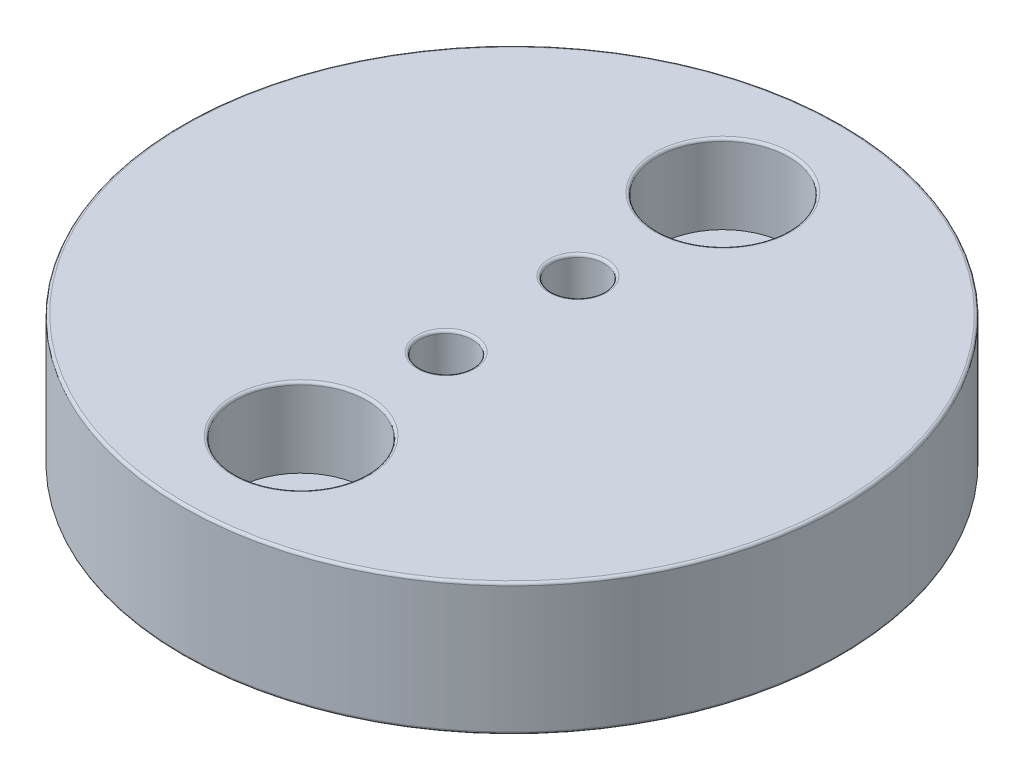
ISO-10303-21;
HEADER;
FILE_DESCRIPTION(('STEP AP214'),'2;1');
FILE_NAME('part.step','',(''),(''),'','','');
FILE_SCHEMA(('AUTOMOTIVE_DESIGN { 1 0 10303 214 1 1 1 1 }'));
ENDSEC;
DATA;
#1=APPLICATION_CONTEXT('core data for automotive mechanical design processes');
#2=APPLICATION_PROTOCOL_DEFINITION('international standard','automotive_design',2000,#1);
#3=PRODUCT_CONTEXT('',#1,'mechanical');
#4=PRODUCT('Part','Part','',(#3));
#5=PRODUCT_RELATED_PRODUCT_CATEGORY('part','',(#4));
#6=PRODUCT_DEFINITION_FORMATION('','',#4);
#7=PRODUCT_DEFINITION_CONTEXT('part definition',#1,'design');
#8=PRODUCT_DEFINITION('design','',#6,#7);
#9=PRODUCT_DEFINITION_SHAPE('','',#8);
#10=(LENGTH_UNIT() NAMED_UNIT(*) SI_UNIT(.MILLI.,.METRE.));
#11=(NAMED_UNIT(*) PLANE_ANGLE_UNIT() SI_UNIT($,.RADIAN.));
#12=(NAMED_UNIT(*) SI_UNIT($,.STERADIAN.) SOLID_ANGLE_UNIT());
#13=UNCERTAINTY_MEASURE_WITH_UNIT(LENGTH_MEASURE(1.E-05),#10,'distance_accuracy_value','');
#14=(GEOMETRIC_REPRESENTATION_CONTEXT(3) GLOBAL_UNCERTAINTY_ASSIGNED_CONTEXT((#13)) GLOBAL_UNIT_ASSIGNED_CONTEXT((#10,
#11,#12)) REPRESENTATION_CONTEXT('',''));
#15=CARTESIAN_POINT('',(0.,0.,0.));
#16=DIRECTION('',(0.,0.,1.));
#17=DIRECTION('',(1.,0.,0.));
#18=AXIS2_PLACEMENT_3D('',#15,#16,#17);
#19=CARTESIAN_POINT('',(0.,-0.00100000000000013,2.5));
#20=DIRECTION('',(0.,1.,0.));
#21=DIRECTION('',(0.,0.,1.));
#22=AXIS2_PLACEMENT_3D('',#19,#20,#21);
#23=CYLINDRICAL_SURFACE('',#22,1.);
#24=CARTESIAN_POINT('',(0.,3.3,2.5));
#25=DIRECTION('',(0.,-1.,0.));
#26=DIRECTION('',(0.,0.,-1.));
#27=AXIS2_PLACEMENT_3D('',#24,#25,#26);
#28=CIRCLE('',#27,1.);
#29=CARTESIAN_POINT('',(0.,3.3,1.5));
#30=VERTEX_POINT('',#29);
#31=EDGE_CURVE('E109',#30,#30,#28,.T.);
#32=ORIENTED_EDGE('',*,*,#31,.T.);
#33=EDGE_LOOP('',(#32));
#34=FACE_BOUND('',#33,.T.);
#35=CARTESIAN_POINT('',(0.,4.9,2.5));
#36=DIRECTION('',(0.,1.,0.));
#37=DIRECTION('',(0.,0.,1.));
#38=AXIS2_PLACEMENT_3D('',#35,#36,#37);
#39=CIRCLE('',#38,1.);
#40=CARTESIAN_POINT('',(0.,4.9,3.5));
#41=VERTEX_POINT('',#40);
#42=EDGE_CURVE('E112',#41,#41,#39,.T.);
#43=ORIENTED_EDGE('',*,*,#42,.T.);
#44=EDGE_LOOP('',(#43));
#45=FACE_BOUND('',#44,.T.);
#46=ADVANCED_FACE('F35',(#34,#45),#23,.F.);
#47=CARTESIAN_POINT('',(0.,-0.00100000000000013,-2.5));
#48=DIRECTION('',(0.,1.,0.));
#49=DIRECTION('',(0.,0.,1.));
#50=AXIS2_PLACEMENT_3D('',#47,#48,#49);
#51=CYLINDRICAL_SURFACE('',#50,1.);
#52=CARTESIAN_POINT('',(0.,3.3,-2.5));
#53=DIRECTION('',(0.,-1.,0.));
#54=DIRECTION('',(0.,0.,-1.));
#55=AXIS2_PLACEMENT_3D('',#52,#53,#54);
#56=CIRCLE('',#55,1.);
#57=CARTESIAN_POINT('',(0.,3.3,-3.5));
#58=VERTEX_POINT('',#57);
#59=EDGE_CURVE('E118',#58,#58,#56,.T.);
#60=ORIENTED_EDGE('',*,*,#59,.T.);
#61=EDGE_LOOP('',(#60));
#62=FACE_BOUND('',#61,.T.);
#63=CARTESIAN_POINT('',(0.,4.9,-2.5));
#64=DIRECTION('',(0.,1.,0.));
#65=DIRECTION('',(0.,0.,1.));
#66=AXIS2_PLACEMENT_3D('',#63,#64,#65);
#67=CIRCLE('',#66,1.);
#68=CARTESIAN_POINT('',(0.,4.9,-1.5));
#69=VERTEX_POINT('',#68);
#70=EDGE_CURVE('E121',#69,#69,#67,.T.);
#71=ORIENTED_EDGE('',*,*,#70,.T.);
#72=EDGE_LOOP('',(#71));
#73=FACE_BOUND('',#72,.T.);
#74=ADVANCED_FACE('F159',(#62,#73),#51,.F.);
#75=CARTESIAN_POINT('',(0.,5.,-8.));
#76=DIRECTION('',(0.,-1.,0.));
#77=DIRECTION('',(0.,0.,-1.));
#78=AXIS2_PLACEMENT_3D('',#75,#76,#77);
#79=CYLINDRICAL_SURFACE('',#78,1.25);
#80=CARTESIAN_POINT('',(0.,1.9,-8.));
#81=DIRECTION('',(0.,1.,0.));
#82=DIRECTION('',(0.,0.,1.));
#83=AXIS2_PLACEMENT_3D('',#80,#81,#82);
#84=CIRCLE('',#83,1.25);
#85=CARTESIAN_POINT('',(0.,1.9,-6.75));
#86=VERTEX_POINT('',#85);
#87=EDGE_CURVE('E103',#86,#86,#84,.T.);
#88=ORIENTED_EDGE('',*,*,#87,.T.);
#89=EDGE_LOOP('',(#88));
#90=FACE_BOUND('',#89,.T.);
#91=CARTESIAN_POINT('',(0.,0.1,-8.));
#92=DIRECTION('',(0.,1.,0.));
#93=DIRECTION('',(0.,0.,1.));
#94=AXIS2_PLACEMENT_3D('',#91,#92,#93);
#95=CIRCLE('',#94,1.25);
#96=CARTESIAN_POINT('',(0.,0.1,-6.75));
#97=VERTEX_POINT('',#96);
#98=EDGE_CURVE('E106',#97,#97,#95,.F.);
#99=ORIENTED_EDGE('',*,*,#98,.T.);
#100=EDGE_LOOP('',(#99));
#101=FACE_BOUND('',#100,.T.);
#102=ADVANCED_FACE('F165',(#90,#101),#79,.F.);
#103=CARTESIAN_POINT('',(0.,5.,8.));
#104=DIRECTION('',(0.,-1.,0.));
#105=DIRECTION('',(0.,0.,-1.));
#106=AXIS2_PLACEMENT_3D('',#103,#104,#105);
#107=CYLINDRICAL_SURFACE('',#106,1.25);
#108=CARTESIAN_POINT('',(0.,1.9,8.));
#109=DIRECTION('',(0.,1.,0.));
#110=DIRECTION('',(0.,0.,1.));
#111=AXIS2_PLACEMENT_3D('',#108,#109,#110);
#112=CIRCLE('',#111,1.25);
#113=CARTESIAN_POINT('',(0.,1.9,9.25));
#114=VERTEX_POINT('',#113);
#115=EDGE_CURVE('E94',#114,#114,#112,.T.);
#116=ORIENTED_EDGE('',*,*,#115,.T.);
#117=EDGE_LOOP('',(#116));
#118=FACE_BOUND('',#117,.T.);
#119=CARTESIAN_POINT('',(0.,0.1,8.));
#120=DIRECTION('',(0.,1.,0.));
#121=DIRECTION('',(0.,0.,1.));
#122=AXIS2_PLACEMENT_3D('',#119,#120,#121);
#123=CIRCLE('',#122,1.25);
#124=CARTESIAN_POINT('',(0.,0.1,9.25));
#125=VERTEX_POINT('',#124);
#126=EDGE_CURVE('E97',#125,#125,#123,.F.);
#127=ORIENTED_EDGE('',*,*,#126,.T.);
#128=EDGE_LOOP('',(#127));
#129=FACE_BOUND('',#128,.T.);
#130=ADVANCED_FACE('F171',(#118,#129),#107,.F.);
#131=CARTESIAN_POINT('',(0.,5.,0.));
#132=DIRECTION('',(0.,1.,0.));
#133=DIRECTION('',(0.,0.,1.));
#134=AXIS2_PLACEMENT_3D('',#131,#132,#133);
#135=PLANE('',#134);
#136=CARTESIAN_POINT('',(0.,5.,2.5));
#137=DIRECTION('',(0.,1.,0.));
#138=DIRECTION('',(0.,0.,1.));
#139=AXIS2_PLACEMENT_3D('',#136,#137,#138);
#140=CIRCLE('',#139,1.1);
#141=CARTESIAN_POINT('',(0.,5.,3.6));
#142=VERTEX_POINT('',#141);
#143=EDGE_CURVE('E55',#142,#142,#140,.F.);
#144=ORIENTED_EDGE('',*,*,#143,.T.);
#145=EDGE_LOOP('',(#144));
#146=FACE_BOUND('',#145,.T.);
#147=CARTESIAN_POINT('',(0.,5.,-2.5));
#148=DIRECTION('',(0.,1.,0.));
#149=DIRECTION('',(0.,0.,1.));
#150=AXIS2_PLACEMENT_3D('',#147,#148,#149);
#151=CIRCLE('',#150,1.1);
#152=CARTESIAN_POINT('',(0.,5.,-1.4));
#153=VERTEX_POINT('',#152);
#154=EDGE_CURVE('E58',#153,#153,#151,.F.);
#155=ORIENTED_EDGE('',*,*,#154,.T.);
#156=EDGE_LOOP('',(#155));
#157=FACE_BOUND('',#156,.T.);
#158=CARTESIAN_POINT('',(0.,5.,8.));
#159=DIRECTION('',(0.,1.,0.));
#160=DIRECTION('',(0.,0.,1.));
#161=AXIS2_PLACEMENT_3D('',#158,#159,#160);
#162=CIRCLE('',#161,2.6);
#163=CARTESIAN_POINT('',(0.,5.,10.6));
#164=VERTEX_POINT('',#163);
#165=EDGE_CURVE('E61',#164,#164,#162,.F.);
#166=ORIENTED_EDGE('',*,*,#165,.T.);
#167=EDGE_LOOP('',(#166));
#168=FACE_BOUND('',#167,.T.);
#169=CARTESIAN_POINT('',(0.,5.,-8.));
#170=DIRECTION('',(0.,1.,0.));
#171=DIRECTION('',(0.,0.,1.));
#172=AXIS2_PLACEMENT_3D('',#169,#170,#171);
#173=CIRCLE('',#172,2.6);
#174=CARTESIAN_POINT('',(0.,5.,-5.4));
#175=VERTEX_POINT('',#174);
#176=EDGE_CURVE('E64',#175,#175,#173,.F.);
#177=ORIENTED_EDGE('',*,*,#176,.T.);
#178=EDGE_LOOP('',(#177));
#179=FACE_BOUND('',#178,.T.);
#180=CARTESIAN_POINT('',(0.,5.,0.));
#181=DIRECTION('',(0.,1.,0.));
#182=DIRECTION('',(0.,0.,1.));
#183=AXIS2_PLACEMENT_3D('',#180,#181,#182);
#184=CIRCLE('',#183,12.4);
#185=CARTESIAN_POINT('',(0.,5.,12.4));
#186=VERTEX_POINT('',#185);
#187=EDGE_CURVE('E67',#186,#186,#184,.T.);
#188=ORIENTED_EDGE('',*,*,#187,.T.);
#189=EDGE_LOOP('',(#188));
#190=FACE_BOUND('',#189,.T.);
#191=ADVANCED_FACE('F174',(#146,#157,#168,#179,#190),#135,.T.);
#192=CARTESIAN_POINT('',(0.,0.,0.));
#193=DIRECTION('',(0.,1.,0.));
#194=DIRECTION('',(0.,0.,1.));
#195=AXIS2_PLACEMENT_3D('',#192,#193,#194);
#196=PLANE('',#195);
#197=CARTESIAN_POINT('',(0.,0.,8.));
#198=DIRECTION('',(0.,1.,0.));
#199=DIRECTION('',(0.,0.,1.));
#200=AXIS2_PLACEMENT_3D('',#197,#198,#199);
#201=CIRCLE('',#200,1.35);
#202=CARTESIAN_POINT('',(0.,0.,9.35));
#203=VERTEX_POINT('',#202);
#204=EDGE_CURVE('E76',#203,#203,#201,.T.);
#205=ORIENTED_EDGE('',*,*,#204,.T.);
#206=EDGE_LOOP('',(#205));
#207=FACE_BOUND('',#206,.T.);
#208=CARTESIAN_POINT('',(0.,0.,-8.));
#209=DIRECTION('',(0.,1.,0.));
#210=DIRECTION('',(0.,0.,1.));
#211=AXIS2_PLACEMENT_3D('',#208,#209,#210);
#212=CIRCLE('',#211,1.35);
#213=CARTESIAN_POINT('',(0.,0.,-6.65));
#214=VERTEX_POINT('',#213);
#215=EDGE_CURVE('E79',#214,#214,#212,.T.);
#216=ORIENTED_EDGE('',*,*,#215,.T.);
#217=EDGE_LOOP('',(#216));
#218=FACE_BOUND('',#217,.T.);
#219=CARTESIAN_POINT('',(0.,0.,-2.5));
#220=DIRECTION('',(0.,1.,0.));
#221=DIRECTION('',(0.,0.,1.));
#222=AXIS2_PLACEMENT_3D('',#219,#220,#221);
#223=CIRCLE('',#222,1.75);
#224=CARTESIAN_POINT('',(0.,0.,-0.75));
#225=VERTEX_POINT('',#224);
#226=EDGE_CURVE('E82',#225,#225,#223,.T.);
#227=ORIENTED_EDGE('',*,*,#226,.T.);
#228=EDGE_LOOP('',(#227));
#229=FACE_BOUND('',#228,.T.);
#230=CARTESIAN_POINT('',(0.,0.,2.5));
#231=DIRECTION('',(0.,1.,0.));
#232=DIRECTION('',(0.,0.,1.));
#233=AXIS2_PLACEMENT_3D('',#230,#231,#232);
#234=CIRCLE('',#233,1.75);
#235=CARTESIAN_POINT('',(0.,0.,4.25));
#236=VERTEX_POINT('',#235);
#237=EDGE_CURVE('E85',#236,#236,#234,.T.);
#238=ORIENTED_EDGE('',*,*,#237,.T.);
#239=EDGE_LOOP('',(#238));
#240=FACE_BOUND('',#239,.T.);
#241=CARTESIAN_POINT('',(0.,0.,0.));
#242=DIRECTION('',(0.,1.,0.));
#243=DIRECTION('',(0.,0.,1.));
#244=AXIS2_PLACEMENT_3D('',#241,#242,#243);
#245=CIRCLE('',#244,12.4);
#246=CARTESIAN_POINT('',(0.,0.,12.4));
#247=VERTEX_POINT('',#246);
#248=EDGE_CURVE('E88',#247,#247,#245,.F.);
#249=ORIENTED_EDGE('',*,*,#248,.T.);
#250=EDGE_LOOP('',(#249));
#251=FACE_BOUND('',#250,.T.);
#252=ADVANCED_FACE('F181',(#207,#218,#229,#240,#251),#196,.F.);
#253=CARTESIAN_POINT('',(0.,5.,0.));
#254=DIRECTION('',(0.,-1.,0.));
#255=DIRECTION('',(0.,0.,-1.));
#256=AXIS2_PLACEMENT_3D('',#253,#254,#255);
#257=CYLINDRICAL_SURFACE('',#256,12.5);
#258=CARTESIAN_POINT('',(0.,0.1,0.));
#259=DIRECTION('',(0.,1.,0.));
#260=DIRECTION('',(0.,0.,1.));
#261=AXIS2_PLACEMENT_3D('',#258,#259,#260);
#262=CIRCLE('',#261,12.5);
#263=CARTESIAN_POINT('',(0.,0.1,12.5));
#264=VERTEX_POINT('',#263);
#265=EDGE_CURVE('E10',#264,#264,#262,.T.);
#266=ORIENTED_EDGE('',*,*,#265,.T.);
#267=EDGE_LOOP('',(#266));
#268=FACE_BOUND('',#267,.T.);
#269=CARTESIAN_POINT('',(0.,4.9,0.));
#270=DIRECTION('',(0.,1.,0.));
#271=DIRECTION('',(0.,0.,1.));
#272=AXIS2_PLACEMENT_3D('',#269,#270,#271);
#273=CIRCLE('',#272,12.5);
#274=CARTESIAN_POINT('',(0.,4.9,12.5));
#275=VERTEX_POINT('',#274);
#276=EDGE_CURVE('E42',#275,#275,#273,.F.);
#277=ORIENTED_EDGE('',*,*,#276,.T.);
#278=EDGE_LOOP('',(#277));
#279=FACE_BOUND('',#278,.T.);
#280=ADVANCED_FACE('F185',(#268,#279),#257,.T.);
#281=CARTESIAN_POINT('',(0.,2.,8.));
#282=DIRECTION('',(0.,1.,0.));
#283=DIRECTION('',(0.,0.,1.));
#284=AXIS2_PLACEMENT_3D('',#281,#282,#283);
#285=CYLINDRICAL_SURFACE('',#284,2.5);
#286=CARTESIAN_POINT('',(0.,4.9,8.));
#287=DIRECTION('',(0.,1.,0.));
#288=DIRECTION('',(0.,0.,1.));
#289=AXIS2_PLACEMENT_3D('',#286,#287,#288);
#290=CIRCLE('',#289,2.5);
#291=CARTESIAN_POINT('',(0.,4.9,10.5));
#292=VERTEX_POINT('',#291);
#293=EDGE_CURVE('E50',#292,#292,#290,.T.);
#294=ORIENTED_EDGE('',*,*,#293,.T.);
#295=EDGE_LOOP('',(#294));
#296=FACE_BOUND('',#295,.T.);
#297=CARTESIAN_POINT('',(0.,2.,8.));
#298=DIRECTION('',(0.,1.,0.));
#299=DIRECTION('',(0.,0.,1.));
#300=AXIS2_PLACEMENT_3D('',#297,#298,#299);
#301=CIRCLE('',#300,2.5);
#302=CARTESIAN_POINT('',(0.,2.,10.5));
#303=VERTEX_POINT('',#302);
#304=EDGE_CURVE('E128',#303,#303,#301,.T.);
#305=ORIENTED_EDGE('',*,*,#304,.F.);
#306=EDGE_LOOP('',(#305));
#307=FACE_BOUND('',#306,.T.);
#308=ADVANCED_FACE('F188',(#296,#307),#285,.F.);
#309=CARTESIAN_POINT('',(0.,2.,8.));
#310=DIRECTION('',(0.,1.,0.));
#311=DIRECTION('',(0.,0.,1.));
#312=AXIS2_PLACEMENT_3D('',#309,#310,#311);
#313=PLANE('',#312);
#314=CARTESIAN_POINT('',(0.,2.,8.));
#315=DIRECTION('',(0.,1.,0.));
#316=DIRECTION('',(0.,0.,1.));
#317=AXIS2_PLACEMENT_3D('',#314,#315,#316);
#318=CIRCLE('',#317,1.35);
#319=CARTESIAN_POINT('',(0.,2.,9.35));
#320=VERTEX_POINT('',#319);
#321=EDGE_CURVE('E91',#320,#320,#318,.F.);
#322=ORIENTED_EDGE('',*,*,#321,.T.);
#323=EDGE_LOOP('',(#322));
#324=FACE_BOUND('',#323,.T.);
#325=ORIENTED_EDGE('',*,*,#304,.T.);
#326=EDGE_LOOP('',(#325));
#327=FACE_BOUND('',#326,.T.);
#328=ADVANCED_FACE('F392',(#324,#327),#313,.T.);
#329=CARTESIAN_POINT('',(0.,2.,-8.));
#330=DIRECTION('',(0.,1.,0.));
#331=DIRECTION('',(0.,0.,1.));
#332=AXIS2_PLACEMENT_3D('',#329,#330,#331);
#333=CYLINDRICAL_SURFACE('',#332,2.5);
#334=CARTESIAN_POINT('',(0.,4.9,-8.));
#335=DIRECTION('',(0.,1.,0.));
#336=DIRECTION('',(0.,0.,1.));
#337=AXIS2_PLACEMENT_3D('',#334,#335,#336);
#338=CIRCLE('',#337,2.5);
#339=CARTESIAN_POINT('',(0.,4.9,-5.5));
#340=VERTEX_POINT('',#339);
#341=EDGE_CURVE('E46',#340,#340,#338,.T.);
#342=ORIENTED_EDGE('',*,*,#341,.T.);
#343=EDGE_LOOP('',(#342));
#344=FACE_BOUND('',#343,.T.);
#345=CARTESIAN_POINT('',(0.,2.,-8.));
#346=DIRECTION('',(0.,1.,0.));
#347=DIRECTION('',(0.,0.,1.));
#348=AXIS2_PLACEMENT_3D('',#345,#346,#347);
#349=CIRCLE('',#348,2.5);
#350=CARTESIAN_POINT('',(0.,2.,-5.5));
#351=VERTEX_POINT('',#350);
#352=EDGE_CURVE('E127',#351,#351,#349,.T.);
#353=ORIENTED_EDGE('',*,*,#352,.F.);
#354=EDGE_LOOP('',(#353));
#355=FACE_BOUND('',#354,.T.);
#356=ADVANCED_FACE('F380',(#344,#355),#333,.F.);
#357=CARTESIAN_POINT('',(0.,2.,-8.));
#358=DIRECTION('',(0.,1.,0.));
#359=DIRECTION('',(0.,0.,1.));
#360=AXIS2_PLACEMENT_3D('',#357,#358,#359);
#361=PLANE('',#360);
#362=CARTESIAN_POINT('',(0.,2.,-8.));
#363=DIRECTION('',(0.,1.,0.));
#364=DIRECTION('',(0.,0.,1.));
#365=AXIS2_PLACEMENT_3D('',#362,#363,#364);
#366=CIRCLE('',#365,1.35);
#367=CARTESIAN_POINT('',(0.,2.,-6.65));
#368=VERTEX_POINT('',#367);
#369=EDGE_CURVE('E100',#368,#368,#366,.F.);
#370=ORIENTED_EDGE('',*,*,#369,.T.);
#371=EDGE_LOOP('',(#370));
#372=FACE_BOUND('',#371,.T.);
#373=ORIENTED_EDGE('',*,*,#352,.T.);
#374=EDGE_LOOP('',(#373));
#375=FACE_BOUND('',#374,.T.);
#376=ADVANCED_FACE('F368',(#372,#375),#361,.T.);
#377=CARTESIAN_POINT('',(0.,3.2,-2.5));
#378=DIRECTION('',(0.,-1.,0.));
#379=DIRECTION('',(0.,0.,-1.));
#380=AXIS2_PLACEMENT_3D('',#377,#378,#379);
#381=PLANE('',#380);
#382=CARTESIAN_POINT('',(0.,3.2,-2.5));
#383=DIRECTION('',(0.,-1.,0.));
#384=DIRECTION('',(0.,0.,-1.));
#385=AXIS2_PLACEMENT_3D('',#382,#383,#384);
#386=CIRCLE('',#385,1.1);
#387=CARTESIAN_POINT('',(0.,3.2,-3.6));
#388=VERTEX_POINT('',#387);
#389=EDGE_CURVE('E124',#388,#388,#386,.F.);
#390=ORIENTED_EDGE('',*,*,#389,.T.);
#391=EDGE_LOOP('',(#390));
#392=FACE_BOUND('',#391,.T.);
#393=CARTESIAN_POINT('',(0.,3.2,-2.5));
#394=DIRECTION('',(0.,-1.,0.));
#395=DIRECTION('',(0.,0.,-1.));
#396=AXIS2_PLACEMENT_3D('',#393,#394,#395);
#397=CIRCLE('',#396,1.65);
#398=CARTESIAN_POINT('',(0.,3.2,-4.15));
#399=VERTEX_POINT('',#398);
#400=EDGE_CURVE('E134',#399,#399,#397,.T.);
#401=ORIENTED_EDGE('',*,*,#400,.T.);
#402=EDGE_LOOP('',(#401));
#403=FACE_BOUND('',#402,.T.);
#404=ADVANCED_FACE('F358',(#392,#403),#381,.T.);
#405=CARTESIAN_POINT('',(0.,3.2,-2.5));
#406=DIRECTION('',(0.,-1.,0.));
#407=DIRECTION('',(0.,0.,-1.));
#408=AXIS2_PLACEMENT_3D('',#405,#406,#407);
#409=CYLINDRICAL_SURFACE('',#408,1.65);
#410=CARTESIAN_POINT('',(0.,0.0999999999999998,-2.5));
#411=DIRECTION('',(0.,1.,0.));
#412=DIRECTION('',(0.,0.,1.));
#413=AXIS2_PLACEMENT_3D('',#410,#411,#412);
#414=CIRCLE('',#413,1.65);
#415=CARTESIAN_POINT('',(0.,0.0999999999999998,-0.85));
#416=VERTEX_POINT('',#415);
#417=EDGE_CURVE('E73',#416,#416,#414,.F.);
#418=ORIENTED_EDGE('',*,*,#417,.T.);
#419=EDGE_LOOP('',(#418));
#420=FACE_BOUND('',#419,.T.);
#421=ORIENTED_EDGE('',*,*,#400,.F.);
#422=EDGE_LOOP('',(#421));
#423=FACE_BOUND('',#422,.T.);
#424=ADVANCED_FACE('F154',(#420,#423),#409,.F.);
#425=CARTESIAN_POINT('',(0.,3.2,2.5));
#426=DIRECTION('',(0.,-1.,0.));
#427=DIRECTION('',(0.,0.,-1.));
#428=AXIS2_PLACEMENT_3D('',#425,#426,#427);
#429=PLANE('',#428);
#430=CARTESIAN_POINT('',(0.,3.2,2.5));
#431=DIRECTION('',(0.,-1.,0.));
#432=DIRECTION('',(0.,0.,-1.));
#433=AXIS2_PLACEMENT_3D('',#430,#431,#432);
#434=CIRCLE('',#433,1.1);
#435=CARTESIAN_POINT('',(0.,3.2,1.4));
#436=VERTEX_POINT('',#435);
#437=EDGE_CURVE('E115',#436,#436,#434,.F.);
#438=ORIENTED_EDGE('',*,*,#437,.T.);
#439=EDGE_LOOP('',(#438));
#440=FACE_BOUND('',#439,.T.);
#441=CARTESIAN_POINT('',(0.,3.2,2.5));
#442=DIRECTION('',(0.,-1.,0.));
#443=DIRECTION('',(0.,0.,-1.));
#444=AXIS2_PLACEMENT_3D('',#441,#442,#443);
#445=CIRCLE('',#444,1.65);
#446=CARTESIAN_POINT('',(0.,3.2,0.85));
#447=VERTEX_POINT('',#446);
#448=EDGE_CURVE('E131',#447,#447,#445,.T.);
#449=ORIENTED_EDGE('',*,*,#448,.T.);
#450=EDGE_LOOP('',(#449));
#451=FACE_BOUND('',#450,.T.);
#452=ADVANCED_FACE('F140',(#440,#451),#429,.T.);
#453=CARTESIAN_POINT('',(0.,3.2,2.5));
#454=DIRECTION('',(0.,-1.,0.));
#455=DIRECTION('',(0.,0.,-1.));
#456=AXIS2_PLACEMENT_3D('',#453,#454,#455);
#457=CYLINDRICAL_SURFACE('',#456,1.65);
#458=CARTESIAN_POINT('',(0.,0.0999999999999998,2.5));
#459=DIRECTION('',(0.,1.,0.));
#460=DIRECTION('',(0.,0.,1.));
#461=AXIS2_PLACEMENT_3D('',#458,#459,#460);
#462=CIRCLE('',#461,1.65);
#463=CARTESIAN_POINT('',(0.,0.0999999999999998,4.15));
#464=VERTEX_POINT('',#463);
#465=EDGE_CURVE('E70',#464,#464,#462,.F.);
#466=ORIENTED_EDGE('',*,*,#465,.T.);
#467=EDGE_LOOP('',(#466));
#468=FACE_BOUND('',#467,.T.);
#469=ORIENTED_EDGE('',*,*,#448,.F.);
#470=EDGE_LOOP('',(#469));
#471=FACE_BOUND('',#470,.T.);
#472=ADVANCED_FACE('F142',(#468,#471),#457,.F.);
#473=CARTESIAN_POINT('',(0.,3.3,-2.5));
#474=DIRECTION('',(0.,-1.,0.));
#475=DIRECTION('',(0.,0.,-1.));
#476=AXIS2_PLACEMENT_3D('',#473,#474,#475);
#477=TOROIDAL_SURFACE('',#476,1.1,0.1);
#478=ORIENTED_EDGE('',*,*,#59,.F.);
#479=EDGE_LOOP('',(#478));
#480=FACE_BOUND('',#479,.T.);
#481=ORIENTED_EDGE('',*,*,#389,.F.);
#482=EDGE_LOOP('',(#481));
#483=FACE_BOUND('',#482,.T.);
#484=ADVANCED_FACE('F144',(#480,#483),#477,.T.);
#485=CARTESIAN_POINT('',(0.,3.3,2.5));
#486=DIRECTION('',(0.,-1.,0.));
#487=DIRECTION('',(0.,0.,-1.));
#488=AXIS2_PLACEMENT_3D('',#485,#486,#487);
#489=TOROIDAL_SURFACE('',#488,1.1,0.1);
#490=ORIENTED_EDGE('',*,*,#31,.F.);
#491=EDGE_LOOP('',(#490));
#492=FACE_BOUND('',#491,.T.);
#493=ORIENTED_EDGE('',*,*,#437,.F.);
#494=EDGE_LOOP('',(#493));
#495=FACE_BOUND('',#494,.T.);
#496=ADVANCED_FACE('F151',(#492,#495),#489,.T.);
#497=CARTESIAN_POINT('',(0.,1.9,-8.));
#498=DIRECTION('',(0.,1.,0.));
#499=DIRECTION('',(0.,0.,1.));
#500=AXIS2_PLACEMENT_3D('',#497,#498,#499);
#501=TOROIDAL_SURFACE('',#500,1.35,0.1);
#502=ORIENTED_EDGE('',*,*,#369,.F.);
#503=EDGE_LOOP('',(#502));
#504=FACE_BOUND('',#503,.T.);
#505=ORIENTED_EDGE('',*,*,#87,.F.);
#506=EDGE_LOOP('',(#505));
#507=FACE_BOUND('',#506,.T.);
#508=ADVANCED_FACE('F192',(#504,#507),#501,.T.);
#509=CARTESIAN_POINT('',(0.,1.9,8.));
#510=DIRECTION('',(0.,1.,0.));
#511=DIRECTION('',(0.,0.,1.));
#512=AXIS2_PLACEMENT_3D('',#509,#510,#511);
#513=TOROIDAL_SURFACE('',#512,1.35,0.1);
#514=ORIENTED_EDGE('',*,*,#321,.F.);
#515=EDGE_LOOP('',(#514));
#516=FACE_BOUND('',#515,.T.);
#517=ORIENTED_EDGE('',*,*,#115,.F.);
#518=EDGE_LOOP('',(#517));
#519=FACE_BOUND('',#518,.T.);
#520=ADVANCED_FACE('F196',(#516,#519),#513,.T.);
#521=CARTESIAN_POINT('',(0.,0.1,8.));
#522=DIRECTION('',(0.,1.,0.));
#523=DIRECTION('',(0.,0.,1.));
#524=AXIS2_PLACEMENT_3D('',#521,#522,#523);
#525=TOROIDAL_SURFACE('',#524,1.35,0.1);
#526=ORIENTED_EDGE('',*,*,#126,.F.);
#527=EDGE_LOOP('',(#526));
#528=FACE_BOUND('',#527,.T.);
#529=ORIENTED_EDGE('',*,*,#204,.F.);
#530=EDGE_LOOP('',(#529));
#531=FACE_BOUND('',#530,.T.);
#532=ADVANCED_FACE('F200',(#528,#531),#525,.T.);
#533=CARTESIAN_POINT('',(0.,0.1,-8.));
#534=DIRECTION('',(0.,1.,0.));
#535=DIRECTION('',(0.,0.,1.));
#536=AXIS2_PLACEMENT_3D('',#533,#534,#535);
#537=TOROIDAL_SURFACE('',#536,1.35,0.1);
#538=ORIENTED_EDGE('',*,*,#98,.F.);
#539=EDGE_LOOP('',(#538));
#540=FACE_BOUND('',#539,.T.);
#541=ORIENTED_EDGE('',*,*,#215,.F.);
#542=EDGE_LOOP('',(#541));
#543=FACE_BOUND('',#542,.T.);
#544=ADVANCED_FACE('F204',(#540,#543),#537,.T.);
#545=CARTESIAN_POINT('',(0.,0.0999999999999998,-2.5));
#546=DIRECTION('',(0.,1.,0.));
#547=DIRECTION('',(0.,0.,1.));
#548=AXIS2_PLACEMENT_3D('',#545,#546,#547);
#549=TOROIDAL_SURFACE('',#548,1.75,0.1);
#550=ORIENTED_EDGE('',*,*,#226,.F.);
#551=EDGE_LOOP('',(#550));
#552=FACE_BOUND('',#551,.T.);
#553=ORIENTED_EDGE('',*,*,#417,.F.);
#554=EDGE_LOOP('',(#553));
#555=FACE_BOUND('',#554,.T.);
#556=ADVANCED_FACE('F208',(#552,#555),#549,.T.);
#557=CARTESIAN_POINT('',(0.,0.0999999999999998,2.5));
#558=DIRECTION('',(0.,1.,0.));
#559=DIRECTION('',(0.,0.,1.));
#560=AXIS2_PLACEMENT_3D('',#557,#558,#559);
#561=TOROIDAL_SURFACE('',#560,1.75,0.1);
#562=ORIENTED_EDGE('',*,*,#237,.F.);
#563=EDGE_LOOP('',(#562));
#564=FACE_BOUND('',#563,.T.);
#565=ORIENTED_EDGE('',*,*,#465,.F.);
#566=EDGE_LOOP('',(#565));
#567=FACE_BOUND('',#566,.T.);
#568=ADVANCED_FACE('F212',(#564,#567),#561,.T.);
#569=CARTESIAN_POINT('',(0.,4.9,2.5));
#570=DIRECTION('',(0.,1.,0.));
#571=DIRECTION('',(0.,0.,1.));
#572=AXIS2_PLACEMENT_3D('',#569,#570,#571);
#573=TOROIDAL_SURFACE('',#572,1.1,0.1);
#574=ORIENTED_EDGE('',*,*,#143,.F.);
#575=EDGE_LOOP('',(#574));
#576=FACE_BOUND('',#575,.T.);
#577=ORIENTED_EDGE('',*,*,#42,.F.);
#578=EDGE_LOOP('',(#577));
#579=FACE_BOUND('',#578,.T.);
#580=ADVANCED_FACE('F216',(#576,#579),#573,.T.);
#581=CARTESIAN_POINT('',(0.,4.9,-2.5));
#582=DIRECTION('',(0.,1.,0.));
#583=DIRECTION('',(0.,0.,1.));
#584=AXIS2_PLACEMENT_3D('',#581,#582,#583);
#585=TOROIDAL_SURFACE('',#584,1.1,0.1);
#586=ORIENTED_EDGE('',*,*,#154,.F.);
#587=EDGE_LOOP('',(#586));
#588=FACE_BOUND('',#587,.T.);
#589=ORIENTED_EDGE('',*,*,#70,.F.);
#590=EDGE_LOOP('',(#589));
#591=FACE_BOUND('',#590,.T.);
#592=ADVANCED_FACE('F220',(#588,#591),#585,.T.);
#593=CARTESIAN_POINT('',(0.,4.9,8.));
#594=DIRECTION('',(0.,1.,0.));
#595=DIRECTION('',(0.,0.,1.));
#596=AXIS2_PLACEMENT_3D('',#593,#594,#595);
#597=TOROIDAL_SURFACE('',#596,2.6,0.1);
#598=ORIENTED_EDGE('',*,*,#165,.F.);
#599=EDGE_LOOP('',(#598));
#600=FACE_BOUND('',#599,.T.);
#601=ORIENTED_EDGE('',*,*,#293,.F.);
#602=EDGE_LOOP('',(#601));
#603=FACE_BOUND('',#602,.T.);
#604=ADVANCED_FACE('F224',(#600,#603),#597,.T.);
#605=CARTESIAN_POINT('',(0.,4.9,-8.));
#606=DIRECTION('',(0.,1.,0.));
#607=DIRECTION('',(0.,0.,1.));
#608=AXIS2_PLACEMENT_3D('',#605,#606,#607);
#609=TOROIDAL_SURFACE('',#608,2.6,0.1);
#610=ORIENTED_EDGE('',*,*,#176,.F.);
#611=EDGE_LOOP('',(#610));
#612=FACE_BOUND('',#611,.T.);
#613=ORIENTED_EDGE('',*,*,#341,.F.);
#614=EDGE_LOOP('',(#613));
#615=FACE_BOUND('',#614,.T.);
#616=ADVANCED_FACE('F228',(#612,#615),#609,.T.);
#617=CARTESIAN_POINT('',(0.,0.1,0.));
#618=DIRECTION('',(0.,1.,0.));
#619=DIRECTION('',(0.,0.,1.));
#620=AXIS2_PLACEMENT_3D('',#617,#618,#619);
#621=TOROIDAL_SURFACE('',#620,12.4,0.1);
#622=ORIENTED_EDGE('',*,*,#248,.F.);
#623=EDGE_LOOP('',(#622));
#624=FACE_BOUND('',#623,.T.);
#625=ORIENTED_EDGE('',*,*,#265,.F.);
#626=EDGE_LOOP('',(#625));
#627=FACE_BOUND('',#626,.T.);
#628=ADVANCED_FACE('F231',(#624,#627),#621,.T.);
#629=CARTESIAN_POINT('',(0.,4.9,0.));
#630=DIRECTION('',(0.,1.,0.));
#631=DIRECTION('',(0.,0.,1.));
#632=AXIS2_PLACEMENT_3D('',#629,#630,#631);
#633=TOROIDAL_SURFACE('',#632,12.4,0.1);
#634=ORIENTED_EDGE('',*,*,#276,.F.);
#635=EDGE_LOOP('',(#634));
#636=FACE_BOUND('',#635,.T.);
#637=ORIENTED_EDGE('',*,*,#187,.F.);
#638=EDGE_LOOP('',(#637));
#639=FACE_BOUND('',#638,.T.);
#640=ADVANCED_FACE('F37',(#636,#639),#633,.T.);
#641=CLOSED_SHELL('',(#46,#74,#102,#130,#191,#252,#280,#308,#328,#356,#376,#404,#424,#452,#472,
#484,#496,#508,#520,#532,#544,#556,#568,#580,#592,#604,#616,#628,#640));
#642=MANIFOLD_SOLID_BREP('B2',#641);
#643=ADVANCED_BREP_SHAPE_REPRESENTATION('',(#18,#642),#14);
#644=SHAPE_DEFINITION_REPRESENTATION(#9,#643);
ENDSEC;
END-ISO-10303-21;
